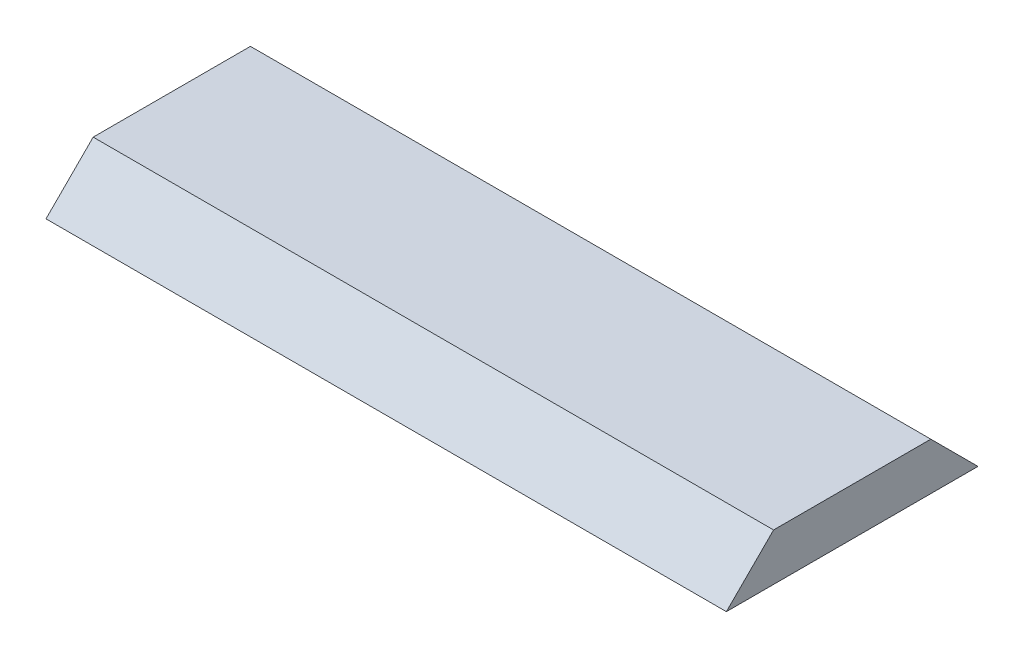
ISO-10303-21;
HEADER;
FILE_DESCRIPTION(('STEP AP214'),'2;1');
FILE_NAME('part.step','',(''),(''),'','','');
FILE_SCHEMA(('AUTOMOTIVE_DESIGN { 1 0 10303 214 1 1 1 1 }'));
ENDSEC;
DATA;
#1=APPLICATION_CONTEXT('core data for automotive mechanical design processes');
#2=APPLICATION_PROTOCOL_DEFINITION('international standard','automotive_design',2000,#1);
#3=PRODUCT_CONTEXT('',#1,'mechanical');
#4=PRODUCT('Part','Part','',(#3));
#5=PRODUCT_RELATED_PRODUCT_CATEGORY('part','',(#4));
#6=PRODUCT_DEFINITION_FORMATION('','',#4);
#7=PRODUCT_DEFINITION_CONTEXT('part definition',#1,'design');
#8=PRODUCT_DEFINITION('design','',#6,#7);
#9=PRODUCT_DEFINITION_SHAPE('','',#8);
#10=(LENGTH_UNIT() NAMED_UNIT(*) SI_UNIT(.MILLI.,.METRE.));
#11=(NAMED_UNIT(*) PLANE_ANGLE_UNIT() SI_UNIT($,.RADIAN.));
#12=(NAMED_UNIT(*) SI_UNIT($,.STERADIAN.) SOLID_ANGLE_UNIT());
#13=UNCERTAINTY_MEASURE_WITH_UNIT(LENGTH_MEASURE(1.E-05),#10,'distance_accuracy_value','');
#14=(GEOMETRIC_REPRESENTATION_CONTEXT(3) GLOBAL_UNCERTAINTY_ASSIGNED_CONTEXT((#13)) GLOBAL_UNIT_ASSIGNED_CONTEXT((#10,
#11,#12)) REPRESENTATION_CONTEXT('',''));
#15=CARTESIAN_POINT('',(0.,0.,0.));
#16=DIRECTION('',(0.,0.,1.));
#17=DIRECTION('',(1.,0.,0.));
#18=AXIS2_PLACEMENT_3D('',#15,#16,#17);
#19=CARTESIAN_POINT('',(64.9,9.,-25.));
#20=DIRECTION('',(-1.,0.,0.));
#21=DIRECTION('',(0.,0.,1.));
#22=AXIS2_PLACEMENT_3D('',#19,#20,#21);
#23=PLANE('',#22);
#24=DIRECTION('',(0.,0.,-1.));
#25=VECTOR('',#24,1.);
#26=CARTESIAN_POINT('',(64.9,9.,-25.));
#27=LINE('',#26,#25);
#28=CARTESIAN_POINT('',(64.9,9.,14.9999999999998));
#29=VERTEX_POINT('',#28);
#30=CARTESIAN_POINT('',(64.9,9.,-14.9999999999998));
#31=VERTEX_POINT('',#30);
#32=EDGE_CURVE('E97',#29,#31,#27,.T.);
#33=ORIENTED_EDGE('',*,*,#32,.F.);
#34=DIRECTION('',(0.,-0.707106781186544,0.707106781186551));
#35=VECTOR('',#34,1.);
#36=CARTESIAN_POINT('',(64.9,9.,14.9999999999998));
#37=LINE('',#36,#35);
#38=CARTESIAN_POINT('',(64.9,0.,23.9999999999999));
#39=VERTEX_POINT('',#38);
#40=EDGE_CURVE('E81',#29,#39,#37,.T.);
#41=ORIENTED_EDGE('',*,*,#40,.T.);
#42=DIRECTION('',(0.,0.,-1.));
#43=VECTOR('',#42,1.);
#44=CARTESIAN_POINT('',(64.9,0.,-25.));
#45=LINE('',#44,#43);
#46=CARTESIAN_POINT('',(64.9,0.,-23.9999999999999));
#47=VERTEX_POINT('',#46);
#48=EDGE_CURVE('E107',#39,#47,#45,.T.);
#49=ORIENTED_EDGE('',*,*,#48,.T.);
#50=DIRECTION('',(0.,0.707106781186544,0.707106781186551));
#51=VECTOR('',#50,1.);
#52=CARTESIAN_POINT('',(64.9,9.,-14.9999999999998));
#53=LINE('',#52,#51);
#54=EDGE_CURVE('E90',#47,#31,#53,.T.);
#55=ORIENTED_EDGE('',*,*,#54,.T.);
#56=EDGE_LOOP('',(#33,#41,#49,#55));
#57=FACE_BOUND('',#56,.T.);
#58=ADVANCED_FACE('F41',(#57),#23,.F.);
#59=CARTESIAN_POINT('',(-64.9,9.,-25.));
#60=DIRECTION('',(1.,0.,0.));
#61=DIRECTION('',(0.,0.,-1.));
#62=AXIS2_PLACEMENT_3D('',#59,#60,#61);
#63=PLANE('',#62);
#64=DIRECTION('',(0.,0.,1.));
#65=VECTOR('',#64,1.);
#66=CARTESIAN_POINT('',(-64.9,0.,-25.));
#67=LINE('',#66,#65);
#68=CARTESIAN_POINT('',(-64.9,0.,-23.9999999999999));
#69=VERTEX_POINT('',#68);
#70=CARTESIAN_POINT('',(-64.9,0.,23.9999999999999));
#71=VERTEX_POINT('',#70);
#72=EDGE_CURVE('E103',#69,#71,#67,.T.);
#73=ORIENTED_EDGE('',*,*,#72,.T.);
#74=DIRECTION('',(0.,0.707106781186544,-0.707106781186551));
#75=VECTOR('',#74,1.);
#76=CARTESIAN_POINT('',(-64.9,9.,14.9999999999998));
#77=LINE('',#76,#75);
#78=CARTESIAN_POINT('',(-64.9,9.,14.9999999999998));
#79=VERTEX_POINT('',#78);
#80=EDGE_CURVE('E11',#71,#79,#77,.T.);
#81=ORIENTED_EDGE('',*,*,#80,.T.);
#82=DIRECTION('',(0.,0.,1.));
#83=VECTOR('',#82,1.);
#84=CARTESIAN_POINT('',(-64.9,9.,-25.));
#85=LINE('',#84,#83);
#86=CARTESIAN_POINT('',(-64.9,9.,-14.9999999999998));
#87=VERTEX_POINT('',#86);
#88=EDGE_CURVE('E99',#87,#79,#85,.T.);
#89=ORIENTED_EDGE('',*,*,#88,.F.);
#90=DIRECTION('',(0.,-0.707106781186544,-0.707106781186551));
#91=VECTOR('',#90,1.);
#92=CARTESIAN_POINT('',(-64.9,9.,-14.9999999999998));
#93=LINE('',#92,#91);
#94=EDGE_CURVE('E50',#87,#69,#93,.T.);
#95=ORIENTED_EDGE('',*,*,#94,.T.);
#96=EDGE_LOOP('',(#73,#81,#89,#95));
#97=FACE_BOUND('',#96,.T.);
#98=ADVANCED_FACE('F155',(#97),#63,.F.);
#99=CARTESIAN_POINT('',(0.,9.,0.));
#100=DIRECTION('',(0.,1.,0.));
#101=DIRECTION('',(0.,0.,1.));
#102=AXIS2_PLACEMENT_3D('',#99,#100,#101);
#103=PLANE('',#102);
#104=ORIENTED_EDGE('',*,*,#88,.T.);
#105=DIRECTION('',(1.,0.,0.));
#106=VECTOR('',#105,1.);
#107=CARTESIAN_POINT('',(64.9,9.,14.9999999999998));
#108=LINE('',#107,#106);
#109=EDGE_CURVE('E85',#79,#29,#108,.T.);
#110=ORIENTED_EDGE('',*,*,#109,.T.);
#111=ORIENTED_EDGE('',*,*,#32,.T.);
#112=DIRECTION('',(-1.,0.,0.));
#113=VECTOR('',#112,1.);
#114=CARTESIAN_POINT('',(-64.9,9.,-14.9999999999998));
#115=LINE('',#114,#113);
#116=EDGE_CURVE('E100',#31,#87,#115,.T.);
#117=ORIENTED_EDGE('',*,*,#116,.T.);
#118=EDGE_LOOP('',(#104,#110,#111,#117));
#119=FACE_BOUND('',#118,.T.);
#120=ADVANCED_FACE('F95',(#119),#103,.T.);
#121=CARTESIAN_POINT('',(0.,0.,0.));
#122=DIRECTION('',(0.,1.,0.));
#123=DIRECTION('',(0.,0.,1.));
#124=AXIS2_PLACEMENT_3D('',#121,#122,#123);
#125=PLANE('',#124);
#126=CARTESIAN_POINT('',(-32.45,0.,-12.5));
#127=DIRECTION('',(0.,1.,0.));
#128=DIRECTION('',(0.,0.,1.));
#129=AXIS2_PLACEMENT_3D('',#126,#127,#128);
#130=CIRCLE('',#129,3.34999999999999);
#131=CARTESIAN_POINT('',(-32.45,0.,-9.15000000000001));
#132=VERTEX_POINT('',#131);
#133=EDGE_CURVE('E131',#132,#132,#130,.T.);
#134=ORIENTED_EDGE('',*,*,#133,.T.);
#135=EDGE_LOOP('',(#134));
#136=FACE_BOUND('',#135,.T.);
#137=CARTESIAN_POINT('',(0.,0.,-12.5));
#138=DIRECTION('',(0.,1.,0.));
#139=DIRECTION('',(0.,0.,1.));
#140=AXIS2_PLACEMENT_3D('',#137,#138,#139);
#141=CIRCLE('',#140,3.34999999999999);
#142=CARTESIAN_POINT('',(0.,0.,-9.15000000000001));
#143=VERTEX_POINT('',#142);
#144=EDGE_CURVE('E128',#143,#143,#141,.T.);
#145=ORIENTED_EDGE('',*,*,#144,.T.);
#146=EDGE_LOOP('',(#145));
#147=FACE_BOUND('',#146,.T.);
#148=CARTESIAN_POINT('',(32.45,0.,-12.5));
#149=DIRECTION('',(0.,1.,0.));
#150=DIRECTION('',(0.,0.,1.));
#151=AXIS2_PLACEMENT_3D('',#148,#149,#150);
#152=CIRCLE('',#151,3.34999999999999);
#153=CARTESIAN_POINT('',(32.45,0.,-9.15000000000001));
#154=VERTEX_POINT('',#153);
#155=EDGE_CURVE('E125',#154,#154,#152,.T.);
#156=ORIENTED_EDGE('',*,*,#155,.T.);
#157=EDGE_LOOP('',(#156));
#158=FACE_BOUND('',#157,.T.);
#159=CARTESIAN_POINT('',(32.45,0.,12.5));
#160=DIRECTION('',(0.,1.,0.));
#161=DIRECTION('',(0.,0.,1.));
#162=AXIS2_PLACEMENT_3D('',#159,#160,#161);
#163=CIRCLE('',#162,3.34999999999999);
#164=CARTESIAN_POINT('',(32.45,0.,15.85));
#165=VERTEX_POINT('',#164);
#166=EDGE_CURVE('E122',#165,#165,#163,.T.);
#167=ORIENTED_EDGE('',*,*,#166,.T.);
#168=EDGE_LOOP('',(#167));
#169=FACE_BOUND('',#168,.T.);
#170=CARTESIAN_POINT('',(0.,0.,12.5));
#171=DIRECTION('',(0.,1.,0.));
#172=DIRECTION('',(0.,0.,1.));
#173=AXIS2_PLACEMENT_3D('',#170,#171,#172);
#174=CIRCLE('',#173,3.34999999999999);
#175=CARTESIAN_POINT('',(0.,0.,15.85));
#176=VERTEX_POINT('',#175);
#177=EDGE_CURVE('E119',#176,#176,#174,.T.);
#178=ORIENTED_EDGE('',*,*,#177,.T.);
#179=EDGE_LOOP('',(#178));
#180=FACE_BOUND('',#179,.T.);
#181=CARTESIAN_POINT('',(-32.45,0.,12.5));
#182=DIRECTION('',(0.,1.,0.));
#183=DIRECTION('',(0.,0.,1.));
#184=AXIS2_PLACEMENT_3D('',#181,#182,#183);
#185=CIRCLE('',#184,3.34999999999999);
#186=CARTESIAN_POINT('',(-32.45,0.,15.85));
#187=VERTEX_POINT('',#186);
#188=EDGE_CURVE('E116',#187,#187,#185,.T.);
#189=ORIENTED_EDGE('',*,*,#188,.T.);
#190=EDGE_LOOP('',(#189));
#191=FACE_BOUND('',#190,.T.);
#192=ORIENTED_EDGE('',*,*,#48,.F.);
#193=DIRECTION('',(-1.,0.,0.));
#194=VECTOR('',#193,1.);
#195=CARTESIAN_POINT('',(0.,0.,23.9999999999999));
#196=LINE('',#195,#194);
#197=EDGE_CURVE('E57',#39,#71,#196,.T.);
#198=ORIENTED_EDGE('',*,*,#197,.T.);
#199=ORIENTED_EDGE('',*,*,#72,.F.);
#200=DIRECTION('',(1.,0.,0.));
#201=VECTOR('',#200,1.);
#202=CARTESIAN_POINT('',(0.,0.,-23.9999999999999));
#203=LINE('',#202,#201);
#204=EDGE_CURVE('E89',#69,#47,#203,.T.);
#205=ORIENTED_EDGE('',*,*,#204,.T.);
#206=EDGE_LOOP('',(#192,#198,#199,#205));
#207=FACE_BOUND('',#206,.T.);
#208=ADVANCED_FACE('F153',(#136,#147,#158,#169,#180,#191,#207),#125,.F.);
#209=CARTESIAN_POINT('',(-32.45,8.,12.5));
#210=DIRECTION('',(0.,-1.,0.));
#211=DIRECTION('',(0.,0.,-1.));
#212=AXIS2_PLACEMENT_3D('',#209,#210,#211);
#213=CYLINDRICAL_SURFACE('',#212,2.35);
#214=CARTESIAN_POINT('',(-32.45,0.999999999999985,12.5));
#215=DIRECTION('',(0.,1.,0.));
#216=DIRECTION('',(0.,0.,1.));
#217=AXIS2_PLACEMENT_3D('',#214,#215,#216);
#218=CIRCLE('',#217,2.35);
#219=CARTESIAN_POINT('',(-32.45,0.999999999999985,14.85));
#220=VERTEX_POINT('',#219);
#221=EDGE_CURVE('E146',#220,#220,#218,.F.);
#222=ORIENTED_EDGE('',*,*,#221,.T.);
#223=EDGE_LOOP('',(#222));
#224=FACE_BOUND('',#223,.T.);
#225=CARTESIAN_POINT('',(-32.45,8.,12.5));
#226=DIRECTION('',(0.,-1.,0.));
#227=DIRECTION('',(0.,0.,-1.));
#228=AXIS2_PLACEMENT_3D('',#225,#226,#227);
#229=CIRCLE('',#228,2.35);
#230=CARTESIAN_POINT('',(-32.45,8.,10.15));
#231=VERTEX_POINT('',#230);
#232=EDGE_CURVE('E110',#231,#231,#229,.T.);
#233=ORIENTED_EDGE('',*,*,#232,.F.);
#234=EDGE_LOOP('',(#233));
#235=FACE_BOUND('',#234,.T.);
#236=ADVANCED_FACE('F369',(#224,#235),#213,.F.);
#237=CARTESIAN_POINT('',(-32.45,8.,12.5));
#238=DIRECTION('',(0.,-1.,0.));
#239=DIRECTION('',(0.,0.,-1.));
#240=AXIS2_PLACEMENT_3D('',#237,#238,#239);
#241=PLANE('',#240);
#242=ORIENTED_EDGE('',*,*,#232,.T.);
#243=EDGE_LOOP('',(#242));
#244=FACE_BOUND('',#243,.T.);
#245=ADVANCED_FACE('F360',(#244),#241,.T.);
#246=CARTESIAN_POINT('',(0.,8.,12.5));
#247=DIRECTION('',(0.,-1.,0.));
#248=DIRECTION('',(0.,0.,-1.));
#249=AXIS2_PLACEMENT_3D('',#246,#247,#248);
#250=CYLINDRICAL_SURFACE('',#249,2.35);
#251=CARTESIAN_POINT('',(0.,0.999999999999986,12.5));
#252=DIRECTION('',(0.,1.,0.));
#253=DIRECTION('',(0.,0.,1.));
#254=AXIS2_PLACEMENT_3D('',#251,#252,#253);
#255=CIRCLE('',#254,2.35);
#256=CARTESIAN_POINT('',(0.,0.999999999999986,14.85));
#257=VERTEX_POINT('',#256);
#258=EDGE_CURVE('E143',#257,#257,#255,.F.);
#259=ORIENTED_EDGE('',*,*,#258,.T.);
#260=EDGE_LOOP('',(#259));
#261=FACE_BOUND('',#260,.T.);
#262=CARTESIAN_POINT('',(0.,8.,12.5));
#263=DIRECTION('',(0.,-1.,0.));
#264=DIRECTION('',(0.,0.,-1.));
#265=AXIS2_PLACEMENT_3D('',#262,#263,#264);
#266=CIRCLE('',#265,2.35);
#267=CARTESIAN_POINT('',(0.,8.,10.15));
#268=VERTEX_POINT('',#267);
#269=EDGE_CURVE('E420',#268,#268,#266,.T.);
#270=ORIENTED_EDGE('',*,*,#269,.F.);
#271=EDGE_LOOP('',(#270));
#272=FACE_BOUND('',#271,.T.);
#273=ADVANCED_FACE('F350',(#261,#272),#250,.F.);
#274=CARTESIAN_POINT('',(0.,8.,12.5));
#275=DIRECTION('',(0.,-1.,0.));
#276=DIRECTION('',(0.,0.,-1.));
#277=AXIS2_PLACEMENT_3D('',#274,#275,#276);
#278=PLANE('',#277);
#279=ORIENTED_EDGE('',*,*,#269,.T.);
#280=EDGE_LOOP('',(#279));
#281=FACE_BOUND('',#280,.T.);
#282=ADVANCED_FACE('F340',(#281),#278,.T.);
#283=CARTESIAN_POINT('',(32.45,8.,12.5));
#284=DIRECTION('',(0.,-1.,0.));
#285=DIRECTION('',(0.,0.,-1.));
#286=AXIS2_PLACEMENT_3D('',#283,#284,#285);
#287=CYLINDRICAL_SURFACE('',#286,2.35);
#288=CARTESIAN_POINT('',(32.45,0.99999999999999,12.5));
#289=DIRECTION('',(0.,1.,0.));
#290=DIRECTION('',(0.,0.,1.));
#291=AXIS2_PLACEMENT_3D('',#288,#289,#290);
#292=CIRCLE('',#291,2.35);
#293=CARTESIAN_POINT('',(32.45,0.99999999999999,14.85));
#294=VERTEX_POINT('',#293);
#295=EDGE_CURVE('E140',#294,#294,#292,.F.);
#296=ORIENTED_EDGE('',*,*,#295,.T.);
#297=EDGE_LOOP('',(#296));
#298=FACE_BOUND('',#297,.T.);
#299=CARTESIAN_POINT('',(32.45,8.,12.5));
#300=DIRECTION('',(0.,-1.,0.));
#301=DIRECTION('',(0.,0.,-1.));
#302=AXIS2_PLACEMENT_3D('',#299,#300,#301);
#303=CIRCLE('',#302,2.35);
#304=CARTESIAN_POINT('',(32.45,8.,10.15));
#305=VERTEX_POINT('',#304);
#306=EDGE_CURVE('E422',#305,#305,#303,.T.);
#307=ORIENTED_EDGE('',*,*,#306,.F.);
#308=EDGE_LOOP('',(#307));
#309=FACE_BOUND('',#308,.T.);
#310=ADVANCED_FACE('F330',(#298,#309),#287,.F.);
#311=CARTESIAN_POINT('',(32.45,8.,12.5));
#312=DIRECTION('',(0.,-1.,0.));
#313=DIRECTION('',(0.,0.,-1.));
#314=AXIS2_PLACEMENT_3D('',#311,#312,#313);
#315=PLANE('',#314);
#316=ORIENTED_EDGE('',*,*,#306,.T.);
#317=EDGE_LOOP('',(#316));
#318=FACE_BOUND('',#317,.T.);
#319=ADVANCED_FACE('F320',(#318),#315,.T.);
#320=CARTESIAN_POINT('',(32.45,8.,-12.5));
#321=DIRECTION('',(0.,-1.,0.));
#322=DIRECTION('',(0.,0.,-1.));
#323=AXIS2_PLACEMENT_3D('',#320,#321,#322);
#324=CYLINDRICAL_SURFACE('',#323,2.35);
#325=CARTESIAN_POINT('',(32.45,0.99999999999999,-12.5));
#326=DIRECTION('',(0.,1.,0.));
#327=DIRECTION('',(0.,0.,1.));
#328=AXIS2_PLACEMENT_3D('',#325,#326,#327);
#329=CIRCLE('',#328,2.35);
#330=CARTESIAN_POINT('',(32.45,0.99999999999999,-10.15));
#331=VERTEX_POINT('',#330);
#332=EDGE_CURVE('E137',#331,#331,#329,.F.);
#333=ORIENTED_EDGE('',*,*,#332,.T.);
#334=EDGE_LOOP('',(#333));
#335=FACE_BOUND('',#334,.T.);
#336=CARTESIAN_POINT('',(32.45,8.,-12.5));
#337=DIRECTION('',(0.,-1.,0.));
#338=DIRECTION('',(0.,0.,1.));
#339=AXIS2_PLACEMENT_3D('',#336,#337,#338);
#340=CIRCLE('',#339,2.35);
#341=CARTESIAN_POINT('',(32.45,8.,-10.15));
#342=VERTEX_POINT('',#341);
#343=EDGE_CURVE('E426',#342,#342,#340,.T.);
#344=ORIENTED_EDGE('',*,*,#343,.F.);
#345=EDGE_LOOP('',(#344));
#346=FACE_BOUND('',#345,.T.);
#347=ADVANCED_FACE('F310',(#335,#346),#324,.F.);
#348=CARTESIAN_POINT('',(32.45,8.,-12.5));
#349=DIRECTION('',(0.,1.,0.));
#350=DIRECTION('',(0.,0.,1.));
#351=AXIS2_PLACEMENT_3D('',#348,#349,#350);
#352=PLANE('',#351);
#353=ORIENTED_EDGE('',*,*,#343,.T.);
#354=EDGE_LOOP('',(#353));
#355=FACE_BOUND('',#354,.T.);
#356=ADVANCED_FACE('F300',(#355),#352,.F.);
#357=CARTESIAN_POINT('',(0.,8.,-12.5));
#358=DIRECTION('',(0.,-1.,0.));
#359=DIRECTION('',(0.,0.,-1.));
#360=AXIS2_PLACEMENT_3D('',#357,#358,#359);
#361=CYLINDRICAL_SURFACE('',#360,2.35);
#362=CARTESIAN_POINT('',(0.,0.999999999999986,-12.5));
#363=DIRECTION('',(0.,1.,0.));
#364=DIRECTION('',(0.,0.,1.));
#365=AXIS2_PLACEMENT_3D('',#362,#363,#364);
#366=CIRCLE('',#365,2.35);
#367=CARTESIAN_POINT('',(0.,0.999999999999986,-10.15));
#368=VERTEX_POINT('',#367);
#369=EDGE_CURVE('E134',#368,#368,#366,.F.);
#370=ORIENTED_EDGE('',*,*,#369,.T.);
#371=EDGE_LOOP('',(#370));
#372=FACE_BOUND('',#371,.T.);
#373=CARTESIAN_POINT('',(0.,8.,-12.5));
#374=DIRECTION('',(0.,-1.,0.));
#375=DIRECTION('',(0.,0.,1.));
#376=AXIS2_PLACEMENT_3D('',#373,#374,#375);
#377=CIRCLE('',#376,2.35);
#378=CARTESIAN_POINT('',(0.,8.,-10.15));
#379=VERTEX_POINT('',#378);
#380=EDGE_CURVE('E431',#379,#379,#377,.T.);
#381=ORIENTED_EDGE('',*,*,#380,.F.);
#382=EDGE_LOOP('',(#381));
#383=FACE_BOUND('',#382,.T.);
#384=ADVANCED_FACE('F290',(#372,#383),#361,.F.);
#385=CARTESIAN_POINT('',(0.,8.,-12.5));
#386=DIRECTION('',(0.,1.,0.));
#387=DIRECTION('',(0.,0.,1.));
#388=AXIS2_PLACEMENT_3D('',#385,#386,#387);
#389=PLANE('',#388);
#390=ORIENTED_EDGE('',*,*,#380,.T.);
#391=EDGE_LOOP('',(#390));
#392=FACE_BOUND('',#391,.T.);
#393=ADVANCED_FACE('F280',(#392),#389,.F.);
#394=CARTESIAN_POINT('',(-32.45,8.,-12.5));
#395=DIRECTION('',(0.,-1.,0.));
#396=DIRECTION('',(0.,0.,-1.));
#397=AXIS2_PLACEMENT_3D('',#394,#395,#396);
#398=CYLINDRICAL_SURFACE('',#397,2.35);
#399=CARTESIAN_POINT('',(-32.45,0.999999999999985,-12.5));
#400=DIRECTION('',(0.,1.,0.));
#401=DIRECTION('',(0.,0.,1.));
#402=AXIS2_PLACEMENT_3D('',#399,#400,#401);
#403=CIRCLE('',#402,2.35);
#404=CARTESIAN_POINT('',(-32.45,0.999999999999985,-10.15));
#405=VERTEX_POINT('',#404);
#406=EDGE_CURVE('E105',#405,#405,#403,.F.);
#407=ORIENTED_EDGE('',*,*,#406,.T.);
#408=EDGE_LOOP('',(#407));
#409=FACE_BOUND('',#408,.T.);
#410=CARTESIAN_POINT('',(-32.45,8.,-12.5));
#411=DIRECTION('',(0.,-1.,0.));
#412=DIRECTION('',(0.,0.,1.));
#413=AXIS2_PLACEMENT_3D('',#410,#411,#412);
#414=CIRCLE('',#413,2.35);
#415=CARTESIAN_POINT('',(-32.45,8.,-10.15));
#416=VERTEX_POINT('',#415);
#417=EDGE_CURVE('E433',#416,#416,#414,.T.);
#418=ORIENTED_EDGE('',*,*,#417,.F.);
#419=EDGE_LOOP('',(#418));
#420=FACE_BOUND('',#419,.T.);
#421=ADVANCED_FACE('F269',(#409,#420),#398,.F.);
#422=CARTESIAN_POINT('',(-32.45,8.,-12.5));
#423=DIRECTION('',(0.,1.,0.));
#424=DIRECTION('',(0.,0.,1.));
#425=AXIS2_PLACEMENT_3D('',#422,#423,#424);
#426=PLANE('',#425);
#427=ORIENTED_EDGE('',*,*,#417,.T.);
#428=EDGE_LOOP('',(#427));
#429=FACE_BOUND('',#428,.T.);
#430=ADVANCED_FACE('F174',(#429),#426,.F.);
#431=CARTESIAN_POINT('',(-32.45,0.999999999999985,-12.5));
#432=DIRECTION('',(0.,-1.,0.));
#433=DIRECTION('',(0.,0.,-1.));
#434=AXIS2_PLACEMENT_3D('',#431,#432,#433);
#435=CONICAL_SURFACE('',#434,2.35,0.785398163397451);
#436=ORIENTED_EDGE('',*,*,#133,.F.);
#437=EDGE_LOOP('',(#436));
#438=FACE_BOUND('',#437,.T.);
#439=ORIENTED_EDGE('',*,*,#406,.F.);
#440=EDGE_LOOP('',(#439));
#441=FACE_BOUND('',#440,.T.);
#442=ADVANCED_FACE('F167',(#438,#441),#435,.F.);
#443=CARTESIAN_POINT('',(0.,0.999999999999986,-12.5));
#444=DIRECTION('',(0.,-1.,0.));
#445=DIRECTION('',(0.,0.,-1.));
#446=AXIS2_PLACEMENT_3D('',#443,#444,#445);
#447=CONICAL_SURFACE('',#446,2.35,0.785398163397451);
#448=ORIENTED_EDGE('',*,*,#144,.F.);
#449=EDGE_LOOP('',(#448));
#450=FACE_BOUND('',#449,.T.);
#451=ORIENTED_EDGE('',*,*,#369,.F.);
#452=EDGE_LOOP('',(#451));
#453=FACE_BOUND('',#452,.T.);
#454=ADVANCED_FACE('F173',(#450,#453),#447,.F.);
#455=CARTESIAN_POINT('',(32.45,0.99999999999999,-12.5));
#456=DIRECTION('',(0.,-1.,0.));
#457=DIRECTION('',(0.,0.,-1.));
#458=AXIS2_PLACEMENT_3D('',#455,#456,#457);
#459=CONICAL_SURFACE('',#458,2.35,0.785398163397451);
#460=ORIENTED_EDGE('',*,*,#155,.F.);
#461=EDGE_LOOP('',(#460));
#462=FACE_BOUND('',#461,.T.);
#463=ORIENTED_EDGE('',*,*,#332,.F.);
#464=EDGE_LOOP('',(#463));
#465=FACE_BOUND('',#464,.T.);
#466=ADVANCED_FACE('F181',(#462,#465),#459,.F.);
#467=CARTESIAN_POINT('',(32.45,0.99999999999999,12.5));
#468=DIRECTION('',(0.,-1.,0.));
#469=DIRECTION('',(0.,0.,-1.));
#470=AXIS2_PLACEMENT_3D('',#467,#468,#469);
#471=CONICAL_SURFACE('',#470,2.35,0.785398163397451);
#472=ORIENTED_EDGE('',*,*,#166,.F.);
#473=EDGE_LOOP('',(#472));
#474=FACE_BOUND('',#473,.T.);
#475=ORIENTED_EDGE('',*,*,#295,.F.);
#476=EDGE_LOOP('',(#475));
#477=FACE_BOUND('',#476,.T.);
#478=ADVANCED_FACE('F188',(#474,#477),#471,.F.);
#479=CARTESIAN_POINT('',(0.,0.999999999999986,12.5));
#480=DIRECTION('',(0.,-1.,0.));
#481=DIRECTION('',(0.,0.,-1.));
#482=AXIS2_PLACEMENT_3D('',#479,#480,#481);
#483=CONICAL_SURFACE('',#482,2.35,0.785398163397451);
#484=ORIENTED_EDGE('',*,*,#177,.F.);
#485=EDGE_LOOP('',(#484));
#486=FACE_BOUND('',#485,.T.);
#487=ORIENTED_EDGE('',*,*,#258,.F.);
#488=EDGE_LOOP('',(#487));
#489=FACE_BOUND('',#488,.T.);
#490=ADVANCED_FACE('F195',(#486,#489),#483,.F.);
#491=CARTESIAN_POINT('',(-32.45,0.999999999999985,12.5));
#492=DIRECTION('',(0.,-1.,0.));
#493=DIRECTION('',(0.,0.,-1.));
#494=AXIS2_PLACEMENT_3D('',#491,#492,#493);
#495=CONICAL_SURFACE('',#494,2.35,0.785398163397451);
#496=ORIENTED_EDGE('',*,*,#188,.F.);
#497=EDGE_LOOP('',(#496));
#498=FACE_BOUND('',#497,.T.);
#499=ORIENTED_EDGE('',*,*,#221,.F.);
#500=EDGE_LOOP('',(#499));
#501=FACE_BOUND('',#500,.T.);
#502=ADVANCED_FACE('F202',(#498,#501),#495,.F.);
#503=CARTESIAN_POINT('',(0.,9.,14.9999999999998));
#504=DIRECTION('',(0.,0.707106781186551,0.707106781186544));
#505=DIRECTION('',(-1.,0.,0.));
#506=AXIS2_PLACEMENT_3D('',#503,#504,#505);
#507=PLANE('',#506);
#508=ORIENTED_EDGE('',*,*,#80,.F.);
#509=ORIENTED_EDGE('',*,*,#197,.F.);
#510=ORIENTED_EDGE('',*,*,#40,.F.);
#511=ORIENTED_EDGE('',*,*,#109,.F.);
#512=EDGE_LOOP('',(#508,#509,#510,#511));
#513=FACE_BOUND('',#512,.T.);
#514=ADVANCED_FACE('F84',(#513),#507,.T.);
#515=CARTESIAN_POINT('',(0.,9.,-14.9999999999998));
#516=DIRECTION('',(0.,0.707106781186551,-0.707106781186544));
#517=DIRECTION('',(1.,0.,0.));
#518=AXIS2_PLACEMENT_3D('',#515,#516,#517);
#519=PLANE('',#518);
#520=ORIENTED_EDGE('',*,*,#54,.F.);
#521=ORIENTED_EDGE('',*,*,#204,.F.);
#522=ORIENTED_EDGE('',*,*,#94,.F.);
#523=ORIENTED_EDGE('',*,*,#116,.F.);
#524=EDGE_LOOP('',(#520,#521,#522,#523));
#525=FACE_BOUND('',#524,.T.);
#526=ADVANCED_FACE('F44',(#525),#519,.T.);
#527=CLOSED_SHELL('',(#58,#98,#120,#208,#236,#245,#273,#282,#310,#319,#347,#356,#384,#393,#421,
#430,#442,#454,#466,#478,#490,#502,#514,#526));
#528=MANIFOLD_SOLID_BREP('B2',#527);
#529=ADVANCED_BREP_SHAPE_REPRESENTATION('',(#18,#528),#14);
#530=SHAPE_DEFINITION_REPRESENTATION(#9,#529);
ENDSEC;
END-ISO-10303-21;
